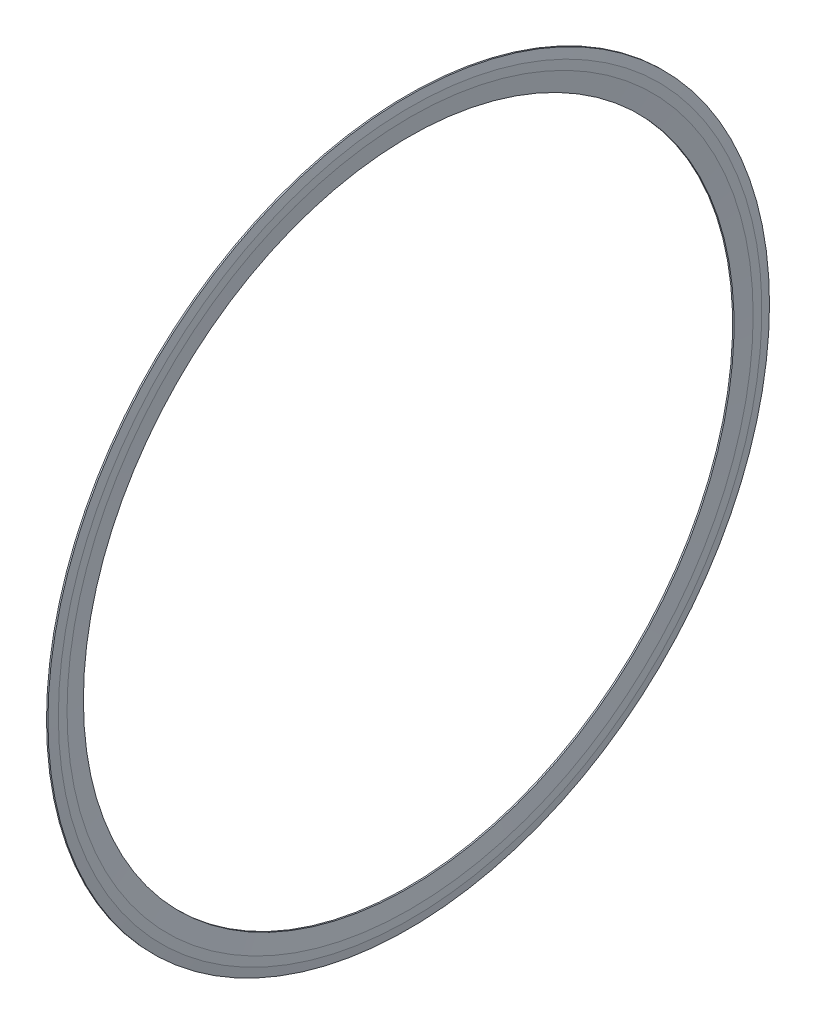
ISO-10303-21;
HEADER;
FILE_DESCRIPTION(('STEP AP214'),'2;1');
FILE_NAME('part.step','',(''),(''),'','','');
FILE_SCHEMA(('AUTOMOTIVE_DESIGN { 1 0 10303 214 1 1 1 1 }'));
ENDSEC;
DATA;
#1=APPLICATION_CONTEXT('core data for automotive mechanical design processes');
#2=APPLICATION_PROTOCOL_DEFINITION('international standard','automotive_design',2000,#1);
#3=PRODUCT_CONTEXT('',#1,'mechanical');
#4=PRODUCT('Part','Part','',(#3));
#5=PRODUCT_RELATED_PRODUCT_CATEGORY('part','',(#4));
#6=PRODUCT_DEFINITION_FORMATION('','',#4);
#7=PRODUCT_DEFINITION_CONTEXT('part definition',#1,'design');
#8=PRODUCT_DEFINITION('design','',#6,#7);
#9=PRODUCT_DEFINITION_SHAPE('','',#8);
#10=(LENGTH_UNIT() NAMED_UNIT(*) SI_UNIT(.MILLI.,.METRE.));
#11=(NAMED_UNIT(*) PLANE_ANGLE_UNIT() SI_UNIT($,.RADIAN.));
#12=(NAMED_UNIT(*) SI_UNIT($,.STERADIAN.) SOLID_ANGLE_UNIT());
#13=UNCERTAINTY_MEASURE_WITH_UNIT(LENGTH_MEASURE(1.E-05),#10,'distance_accuracy_value','');
#14=(GEOMETRIC_REPRESENTATION_CONTEXT(3) GLOBAL_UNCERTAINTY_ASSIGNED_CONTEXT((#13)) GLOBAL_UNIT_ASSIGNED_CONTEXT((#10,
#11,#12)) REPRESENTATION_CONTEXT('',''));
#15=CARTESIAN_POINT('',(0.,0.,0.));
#16=DIRECTION('',(0.,0.,1.));
#17=DIRECTION('',(1.,0.,0.));
#18=AXIS2_PLACEMENT_3D('',#15,#16,#17);
#19=CARTESIAN_POINT('',(0.527,43.025,0.));
#20=DIRECTION('',(1.,0.,0.));
#21=DIRECTION('',(0.,0.,-1.));
#22=AXIS2_PLACEMENT_3D('',#19,#20,#21);
#23=PLANE('',#22);
#24=CARTESIAN_POINT('',(0.527,0.,0.));
#25=DIRECTION('',(-1.,0.,0.));
#26=DIRECTION('',(0.,0.,1.));
#27=AXIS2_PLACEMENT_3D('',#24,#25,#26);
#28=CIRCLE('',#27,40.8);
#29=CARTESIAN_POINT('',(0.527,0.,40.8));
#30=VERTEX_POINT('',#29);
#31=EDGE_CURVE('E10',#30,#30,#28,.T.);
#32=ORIENTED_EDGE('',*,*,#31,.F.);
#33=EDGE_LOOP('',(#32));
#34=FACE_BOUND('',#33,.T.);
#35=CARTESIAN_POINT('',(0.527,0.,0.));
#36=DIRECTION('',(-1.,0.,0.));
#37=DIRECTION('',(0.,0.,1.));
#38=AXIS2_PLACEMENT_3D('',#35,#36,#37);
#39=CIRCLE('',#38,43.025);
#40=CARTESIAN_POINT('',(0.527,0.,43.025));
#41=VERTEX_POINT('',#40);
#42=EDGE_CURVE('E42',#41,#41,#39,.T.);
#43=ORIENTED_EDGE('',*,*,#42,.T.);
#44=EDGE_LOOP('',(#43));
#45=FACE_BOUND('',#44,.T.);
#46=ADVANCED_FACE('F14',(#34,#45),#23,.F.);
#47=CARTESIAN_POINT('',(0.7025,0.,0.));
#48=DIRECTION('',(-1.,0.,0.));
#49=DIRECTION('',(0.,0.,1.));
#50=AXIS2_PLACEMENT_3D('',#47,#48,#49);
#51=CYLINDRICAL_SURFACE('',#50,40.8);
#52=CARTESIAN_POINT('',(0.7025,0.,0.));
#53=DIRECTION('',(-1.,0.,0.));
#54=DIRECTION('',(0.,0.,1.));
#55=AXIS2_PLACEMENT_3D('',#52,#53,#54);
#56=CIRCLE('',#55,40.8);
#57=CARTESIAN_POINT('',(0.7025,0.,40.8));
#58=VERTEX_POINT('',#57);
#59=EDGE_CURVE('E20',#58,#58,#56,.T.);
#60=ORIENTED_EDGE('',*,*,#59,.F.);
#61=EDGE_LOOP('',(#60));
#62=FACE_BOUND('',#61,.T.);
#63=ORIENTED_EDGE('',*,*,#31,.T.);
#64=EDGE_LOOP('',(#63));
#65=FACE_BOUND('',#64,.T.);
#66=ADVANCED_FACE('F79',(#62,#65),#51,.F.);
#67=CARTESIAN_POINT('',(0.7025,0.,0.));
#68=DIRECTION('',(1.,0.,0.));
#69=DIRECTION('',(0.,0.,-1.));
#70=AXIS2_PLACEMENT_3D('',#67,#68,#69);
#71=CONICAL_SURFACE('',#70,40.8,1.49208289056864);
#72=CARTESIAN_POINT('',(0.878,0.,0.));
#73=DIRECTION('',(-1.,0.,0.));
#74=DIRECTION('',(0.,0.,1.));
#75=AXIS2_PLACEMENT_3D('',#72,#73,#74);
#76=CIRCLE('',#75,43.025);
#77=CARTESIAN_POINT('',(0.878,0.,43.025));
#78=VERTEX_POINT('',#77);
#79=EDGE_CURVE('E24',#78,#78,#76,.T.);
#80=ORIENTED_EDGE('',*,*,#79,.F.);
#81=EDGE_LOOP('',(#80));
#82=FACE_BOUND('',#81,.T.);
#83=ORIENTED_EDGE('',*,*,#59,.T.);
#84=EDGE_LOOP('',(#83));
#85=FACE_BOUND('',#84,.T.);
#86=ADVANCED_FACE('F74',(#82,#85),#71,.F.);
#87=CARTESIAN_POINT('',(0.878,43.025,0.));
#88=DIRECTION('',(-1.,0.,0.));
#89=DIRECTION('',(0.,0.,1.));
#90=AXIS2_PLACEMENT_3D('',#87,#88,#89);
#91=PLANE('',#90);
#92=CARTESIAN_POINT('',(0.878,0.,0.));
#93=DIRECTION('',(-1.,0.,0.));
#94=DIRECTION('',(0.,0.,1.));
#95=AXIS2_PLACEMENT_3D('',#92,#93,#94);
#96=CIRCLE('',#95,44.116735786517);
#97=CARTESIAN_POINT('',(0.878,0.,44.116735786517));
#98=VERTEX_POINT('',#97);
#99=EDGE_CURVE('E28',#98,#98,#96,.T.);
#100=ORIENTED_EDGE('',*,*,#99,.F.);
#101=EDGE_LOOP('',(#100));
#102=FACE_BOUND('',#101,.T.);
#103=ORIENTED_EDGE('',*,*,#79,.T.);
#104=EDGE_LOOP('',(#103));
#105=FACE_BOUND('',#104,.T.);
#106=ADVANCED_FACE('F68',(#102,#105),#91,.F.);
#107=CARTESIAN_POINT('',(0.878,0.,0.));
#108=DIRECTION('',(-1.,0.,0.));
#109=DIRECTION('',(0.,0.,1.));
#110=AXIS2_PLACEMENT_3D('',#107,#108,#109);
#111=CONICAL_SURFACE('',#110,44.116735786517,1.41715441492377);
#112=CARTESIAN_POINT('',(0.7025,0.,0.));
#113=DIRECTION('',(-1.,0.,0.));
#114=DIRECTION('',(0.,0.,1.));
#115=AXIS2_PLACEMENT_3D('',#112,#113,#114);
#116=CIRCLE('',#115,45.25);
#117=CARTESIAN_POINT('',(0.7025,0.,45.25));
#118=VERTEX_POINT('',#117);
#119=EDGE_CURVE('E33',#118,#118,#116,.T.);
#120=ORIENTED_EDGE('',*,*,#119,.F.);
#121=EDGE_LOOP('',(#120));
#122=FACE_BOUND('',#121,.T.);
#123=ORIENTED_EDGE('',*,*,#99,.T.);
#124=EDGE_LOOP('',(#123));
#125=FACE_BOUND('',#124,.T.);
#126=ADVANCED_FACE('F62',(#122,#125),#111,.T.);
#127=CARTESIAN_POINT('',(0.7025,0.,0.));
#128=DIRECTION('',(-1.,0.,0.));
#129=DIRECTION('',(0.,0.,1.));
#130=AXIS2_PLACEMENT_3D('',#127,#128,#129);
#131=CYLINDRICAL_SURFACE('',#130,45.25);
#132=CARTESIAN_POINT('',(0.527,0.,0.));
#133=DIRECTION('',(-1.,0.,0.));
#134=DIRECTION('',(0.,0.,1.));
#135=AXIS2_PLACEMENT_3D('',#132,#133,#134);
#136=CIRCLE('',#135,45.25);
#137=CARTESIAN_POINT('',(0.527,0.,45.25));
#138=VERTEX_POINT('',#137);
#139=EDGE_CURVE('E36',#138,#138,#136,.T.);
#140=ORIENTED_EDGE('',*,*,#139,.F.);
#141=EDGE_LOOP('',(#140));
#142=FACE_BOUND('',#141,.T.);
#143=ORIENTED_EDGE('',*,*,#119,.T.);
#144=EDGE_LOOP('',(#143));
#145=FACE_BOUND('',#144,.T.);
#146=ADVANCED_FACE('F56',(#142,#145),#131,.T.);
#147=CARTESIAN_POINT('',(0.527,0.,0.));
#148=DIRECTION('',(-1.,0.,0.));
#149=DIRECTION('',(0.,0.,1.));
#150=AXIS2_PLACEMENT_3D('',#147,#148,#149);
#151=CONICAL_SURFACE('',#150,45.25,1.49208289056864);
#152=CARTESIAN_POINT('',(0.61475,0.,0.));
#153=DIRECTION('',(-1.,0.,0.));
#154=DIRECTION('',(0.,0.,1.));
#155=AXIS2_PLACEMENT_3D('',#152,#153,#154);
#156=CIRCLE('',#155,44.1375);
#157=CARTESIAN_POINT('',(0.61475,0.,44.1375));
#158=VERTEX_POINT('',#157);
#159=EDGE_CURVE('E39',#158,#158,#156,.T.);
#160=ORIENTED_EDGE('',*,*,#159,.F.);
#161=EDGE_LOOP('',(#160));
#162=FACE_BOUND('',#161,.T.);
#163=ORIENTED_EDGE('',*,*,#139,.T.);
#164=EDGE_LOOP('',(#163));
#165=FACE_BOUND('',#164,.T.);
#166=ADVANCED_FACE('F50',(#162,#165),#151,.F.);
#167=CARTESIAN_POINT('',(0.61475,0.,0.));
#168=DIRECTION('',(1.,0.,0.));
#169=DIRECTION('',(0.,0.,-1.));
#170=AXIS2_PLACEMENT_3D('',#167,#168,#169);
#171=CONICAL_SURFACE('',#170,44.1375,1.49208289056864);
#172=ORIENTED_EDGE('',*,*,#42,.F.);
#173=EDGE_LOOP('',(#172));
#174=FACE_BOUND('',#173,.T.);
#175=ORIENTED_EDGE('',*,*,#159,.T.);
#176=EDGE_LOOP('',(#175));
#177=FACE_BOUND('',#176,.T.);
#178=ADVANCED_FACE('F47',(#174,#177),#171,.T.);
#179=CLOSED_SHELL('',(#46,#66,#86,#106,#126,#146,#166,#178));
#180=MANIFOLD_SOLID_BREP('B1',#179);
#181=ADVANCED_BREP_SHAPE_REPRESENTATION('',(#18,#180),#14);
#182=SHAPE_DEFINITION_REPRESENTATION(#9,#181);
ENDSEC;
END-ISO-10303-21;
